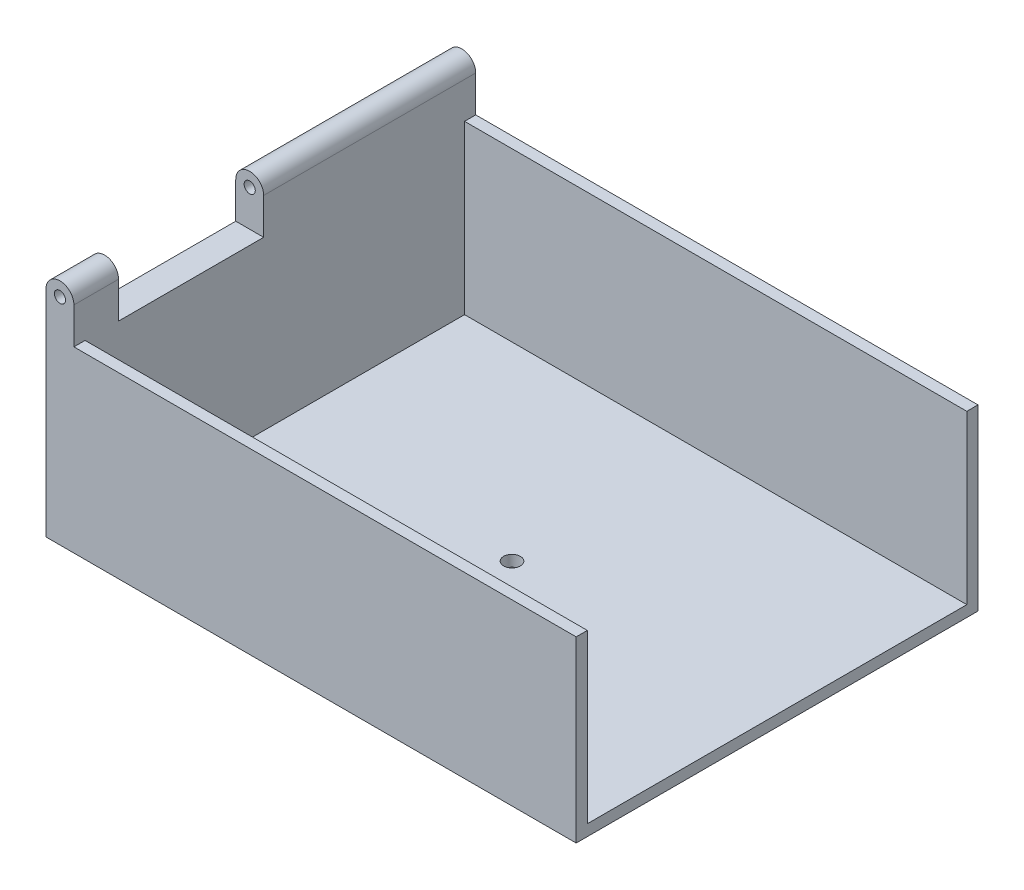
ISO-10303-21;
HEADER;
FILE_DESCRIPTION(('STEP AP214'),'2;1');
FILE_NAME('part.step','',(''),(''),'','','');
FILE_SCHEMA(('AUTOMOTIVE_DESIGN { 1 0 10303 214 1 1 1 1 }'));
ENDSEC;
DATA;
#1=APPLICATION_CONTEXT('core data for automotive mechanical design processes');
#2=APPLICATION_PROTOCOL_DEFINITION('international standard','automotive_design',2000,#1);
#3=PRODUCT_CONTEXT('',#1,'mechanical');
#4=PRODUCT('Part','Part','',(#3));
#5=PRODUCT_RELATED_PRODUCT_CATEGORY('part','',(#4));
#6=PRODUCT_DEFINITION_FORMATION('','',#4);
#7=PRODUCT_DEFINITION_CONTEXT('part definition',#1,'design');
#8=PRODUCT_DEFINITION('design','',#6,#7);
#9=PRODUCT_DEFINITION_SHAPE('','',#8);
#10=(LENGTH_UNIT() NAMED_UNIT(*) SI_UNIT(.MILLI.,.METRE.));
#11=(NAMED_UNIT(*) PLANE_ANGLE_UNIT() SI_UNIT($,.RADIAN.));
#12=(NAMED_UNIT(*) SI_UNIT($,.STERADIAN.) SOLID_ANGLE_UNIT());
#13=UNCERTAINTY_MEASURE_WITH_UNIT(LENGTH_MEASURE(1.E-05),#10,'distance_accuracy_value','');
#14=(GEOMETRIC_REPRESENTATION_CONTEXT(3) GLOBAL_UNCERTAINTY_ASSIGNED_CONTEXT((#13)) GLOBAL_UNIT_ASSIGNED_CONTEXT((#10,
#11,#12)) REPRESENTATION_CONTEXT('',''));
#15=CARTESIAN_POINT('',(0.,0.,0.));
#16=DIRECTION('',(0.,0.,1.));
#17=DIRECTION('',(1.,0.,0.));
#18=AXIS2_PLACEMENT_3D('',#15,#16,#17);
#19=CARTESIAN_POINT('',(-45.,38.5,-36.));
#20=DIRECTION('',(0.,0.,1.));
#21=DIRECTION('',(1.,0.,0.));
#22=AXIS2_PLACEMENT_3D('',#19,#20,#21);
#23=CYLINDRICAL_SURFACE('',#22,2.5);
#24=CARTESIAN_POINT('',(-45.,38.5,28.));
#25=DIRECTION('',(0.,0.,1.));
#26=DIRECTION('',(1.,0.,0.));
#27=AXIS2_PLACEMENT_3D('',#24,#25,#26);
#28=CIRCLE('',#27,2.5);
#29=CARTESIAN_POINT('',(-47.5,38.5,28.));
#30=VERTEX_POINT('',#29);
#31=CARTESIAN_POINT('',(-42.5,38.5,28.));
#32=VERTEX_POINT('',#31);
#33=EDGE_CURVE('E197',#30,#32,#28,.F.);
#34=ORIENTED_EDGE('',*,*,#33,.F.);
#35=DIRECTION('',(0.,0.,1.));
#36=VECTOR('',#35,1.);
#37=CARTESIAN_POINT('',(-47.5,38.5,-36.));
#38=LINE('',#37,#36);
#39=CARTESIAN_POINT('',(-47.5,38.5,36.));
#40=VERTEX_POINT('',#39);
#41=EDGE_CURVE('E216',#30,#40,#38,.T.);
#42=ORIENTED_EDGE('',*,*,#41,.T.);
#43=CARTESIAN_POINT('',(-45.,38.5,36.));
#44=DIRECTION('',(0.,0.,1.));
#45=DIRECTION('',(1.,0.,0.));
#46=AXIS2_PLACEMENT_3D('',#43,#44,#45);
#47=CIRCLE('',#46,2.5);
#48=CARTESIAN_POINT('',(-42.5,38.5,36.));
#49=VERTEX_POINT('',#48);
#50=EDGE_CURVE('E152',#49,#40,#47,.T.);
#51=ORIENTED_EDGE('',*,*,#50,.F.);
#52=DIRECTION('',(0.,0.,1.));
#53=VECTOR('',#52,1.);
#54=CARTESIAN_POINT('',(-42.5,38.5,-36.));
#55=LINE('',#54,#53);
#56=EDGE_CURVE('E147',#32,#49,#55,.T.);
#57=ORIENTED_EDGE('',*,*,#56,.F.);
#58=EDGE_LOOP('',(#34,#42,#51,#57));
#59=FACE_BOUND('',#58,.T.);
#60=ADVANCED_FACE('F39',(#59),#23,.T.);
#61=CARTESIAN_POINT('',(-45.,38.5,-36.));
#62=DIRECTION('',(0.,0.,1.));
#63=DIRECTION('',(1.,0.,0.));
#64=AXIS2_PLACEMENT_3D('',#61,#62,#63);
#65=CYLINDRICAL_SURFACE('',#64,0.999999999999998);
#66=CARTESIAN_POINT('',(-45.,38.5,28.));
#67=DIRECTION('',(0.,0.,1.));
#68=DIRECTION('',(1.,0.,0.));
#69=AXIS2_PLACEMENT_3D('',#66,#67,#68);
#70=CIRCLE('',#69,0.999999999999998);
#71=CARTESIAN_POINT('',(-44.,38.5,28.));
#72=VERTEX_POINT('',#71);
#73=EDGE_CURVE('E196',#72,#72,#70,.F.);
#74=ORIENTED_EDGE('',*,*,#73,.T.);
#75=EDGE_LOOP('',(#74));
#76=FACE_BOUND('',#75,.T.);
#77=CARTESIAN_POINT('',(-45.,38.5,36.));
#78=DIRECTION('',(0.,0.,1.));
#79=DIRECTION('',(1.,0.,0.));
#80=AXIS2_PLACEMENT_3D('',#77,#78,#79);
#81=CIRCLE('',#80,0.999999999999998);
#82=CARTESIAN_POINT('',(-44.,38.5,36.));
#83=VERTEX_POINT('',#82);
#84=EDGE_CURVE('E200',#83,#83,#81,.T.);
#85=ORIENTED_EDGE('',*,*,#84,.T.);
#86=EDGE_LOOP('',(#85));
#87=FACE_BOUND('',#86,.T.);
#88=ADVANCED_FACE('F261',(#76,#87),#65,.F.);
#89=CARTESIAN_POINT('',(47.5,35.,36.));
#90=DIRECTION('',(-1.,0.,0.));
#91=DIRECTION('',(0.,0.,1.));
#92=AXIS2_PLACEMENT_3D('',#89,#90,#91);
#93=PLANE('',#92);
#94=DIRECTION('',(0.,-1.,0.));
#95=VECTOR('',#94,1.);
#96=CARTESIAN_POINT('',(47.5,35.,-36.));
#97=LINE('',#96,#95);
#98=CARTESIAN_POINT('',(47.5,32.,-36.));
#99=VERTEX_POINT('',#98);
#100=CARTESIAN_POINT('',(47.5,0.,-36.));
#101=VERTEX_POINT('',#100);
#102=EDGE_CURVE('E47',#99,#101,#97,.T.);
#103=ORIENTED_EDGE('',*,*,#102,.F.);
#104=DIRECTION('',(0.,0.,-1.));
#105=VECTOR('',#104,1.);
#106=CARTESIAN_POINT('',(47.5,32.,36.));
#107=LINE('',#106,#105);
#108=CARTESIAN_POINT('',(47.5,32.,-34.));
#109=VERTEX_POINT('',#108);
#110=EDGE_CURVE('E164',#109,#99,#107,.T.);
#111=ORIENTED_EDGE('',*,*,#110,.F.);
#112=DIRECTION('',(0.,1.,0.));
#113=VECTOR('',#112,1.);
#114=CARTESIAN_POINT('',(47.5,2.,-34.));
#115=LINE('',#114,#113);
#116=CARTESIAN_POINT('',(47.5,2.,-34.));
#117=VERTEX_POINT('',#116);
#118=EDGE_CURVE('E234',#117,#109,#115,.T.);
#119=ORIENTED_EDGE('',*,*,#118,.F.);
#120=DIRECTION('',(0.,0.,-1.));
#121=VECTOR('',#120,1.);
#122=CARTESIAN_POINT('',(47.5,2.,34.));
#123=LINE('',#122,#121);
#124=CARTESIAN_POINT('',(47.5,2.,34.));
#125=VERTEX_POINT('',#124);
#126=EDGE_CURVE('E225',#125,#117,#123,.T.);
#127=ORIENTED_EDGE('',*,*,#126,.F.);
#128=DIRECTION('',(0.,1.,0.));
#129=VECTOR('',#128,1.);
#130=CARTESIAN_POINT('',(47.5,2.,34.));
#131=LINE('',#130,#129);
#132=CARTESIAN_POINT('',(47.5,32.,34.));
#133=VERTEX_POINT('',#132);
#134=EDGE_CURVE('E237',#125,#133,#131,.T.);
#135=ORIENTED_EDGE('',*,*,#134,.T.);
#136=CARTESIAN_POINT('',(47.5,32.,36.));
#137=VERTEX_POINT('',#136);
#138=EDGE_CURVE('E62',#137,#133,#107,.T.);
#139=ORIENTED_EDGE('',*,*,#138,.F.);
#140=DIRECTION('',(0.,-1.,0.));
#141=VECTOR('',#140,1.);
#142=CARTESIAN_POINT('',(47.5,35.,36.));
#143=LINE('',#142,#141);
#144=CARTESIAN_POINT('',(47.5,0.,36.));
#145=VERTEX_POINT('',#144);
#146=EDGE_CURVE('E163',#137,#145,#143,.T.);
#147=ORIENTED_EDGE('',*,*,#146,.T.);
#148=DIRECTION('',(0.,0.,-1.));
#149=VECTOR('',#148,1.);
#150=CARTESIAN_POINT('',(47.5,0.,36.));
#151=LINE('',#150,#149);
#152=EDGE_CURVE('E233',#145,#101,#151,.T.);
#153=ORIENTED_EDGE('',*,*,#152,.T.);
#154=EDGE_LOOP('',(#103,#111,#119,#127,#135,#139,#147,#153));
#155=FACE_BOUND('',#154,.T.);
#156=ADVANCED_FACE('F41',(#155),#93,.F.);
#157=CARTESIAN_POINT('',(-47.5,35.,-36.));
#158=DIRECTION('',(0.,0.,1.));
#159=DIRECTION('',(1.,0.,0.));
#160=AXIS2_PLACEMENT_3D('',#157,#158,#159);
#161=PLANE('',#160);
#162=DIRECTION('',(0.,1.,0.));
#163=VECTOR('',#162,1.);
#164=CARTESIAN_POINT('',(-42.5,35.,-36.));
#165=LINE('',#164,#163);
#166=CARTESIAN_POINT('',(-42.5,32.,-36.));
#167=VERTEX_POINT('',#166);
#168=CARTESIAN_POINT('',(-42.5,38.5,-36.));
#169=VERTEX_POINT('',#168);
#170=EDGE_CURVE('E205',#167,#169,#165,.T.);
#171=ORIENTED_EDGE('',*,*,#170,.F.);
#172=DIRECTION('',(-1.,0.,0.));
#173=VECTOR('',#172,1.);
#174=CARTESIAN_POINT('',(-42.5,32.,-36.));
#175=LINE('',#174,#173);
#176=EDGE_CURVE('E169',#99,#167,#175,.T.);
#177=ORIENTED_EDGE('',*,*,#176,.F.);
#178=ORIENTED_EDGE('',*,*,#102,.T.);
#179=DIRECTION('',(-1.,0.,0.));
#180=VECTOR('',#179,1.);
#181=CARTESIAN_POINT('',(-47.5,0.,-36.));
#182=LINE('',#181,#180);
#183=CARTESIAN_POINT('',(-47.5,0.,-36.));
#184=VERTEX_POINT('',#183);
#185=EDGE_CURVE('E243',#101,#184,#182,.T.);
#186=ORIENTED_EDGE('',*,*,#185,.T.);
#187=DIRECTION('',(0.,-1.,0.));
#188=VECTOR('',#187,1.);
#189=CARTESIAN_POINT('',(-47.5,35.,-36.));
#190=LINE('',#189,#188);
#191=CARTESIAN_POINT('',(-47.5,38.5,-36.));
#192=VERTEX_POINT('',#191);
#193=EDGE_CURVE('E253',#192,#184,#190,.T.);
#194=ORIENTED_EDGE('',*,*,#193,.F.);
#195=CARTESIAN_POINT('',(-45.,38.5,-36.));
#196=DIRECTION('',(0.,0.,1.));
#197=DIRECTION('',(1.,0.,0.));
#198=AXIS2_PLACEMENT_3D('',#195,#196,#197);
#199=CIRCLE('',#198,2.5);
#200=EDGE_CURVE('E208',#169,#192,#199,.T.);
#201=ORIENTED_EDGE('',*,*,#200,.F.);
#202=EDGE_LOOP('',(#171,#177,#178,#186,#194,#201));
#203=FACE_BOUND('',#202,.T.);
#204=CARTESIAN_POINT('',(-45.,38.5,-36.));
#205=DIRECTION('',(0.,0.,1.));
#206=DIRECTION('',(1.,0.,0.));
#207=AXIS2_PLACEMENT_3D('',#204,#205,#206);
#208=CIRCLE('',#207,0.999999999999998);
#209=CARTESIAN_POINT('',(-44.,38.5,-36.));
#210=VERTEX_POINT('',#209);
#211=EDGE_CURVE('E153',#210,#210,#208,.T.);
#212=ORIENTED_EDGE('',*,*,#211,.T.);
#213=EDGE_LOOP('',(#212));
#214=FACE_BOUND('',#213,.T.);
#215=ADVANCED_FACE('F305',(#203,#214),#161,.F.);
#216=CARTESIAN_POINT('',(-47.5,35.,36.));
#217=DIRECTION('',(1.,0.,0.));
#218=DIRECTION('',(0.,0.,-1.));
#219=AXIS2_PLACEMENT_3D('',#216,#217,#218);
#220=PLANE('',#219);
#221=ORIENTED_EDGE('',*,*,#41,.F.);
#222=DIRECTION('',(0.,1.,0.));
#223=VECTOR('',#222,1.);
#224=CARTESIAN_POINT('',(-47.5,32.,28.));
#225=LINE('',#224,#223);
#226=CARTESIAN_POINT('',(-47.5,32.,28.));
#227=VERTEX_POINT('',#226);
#228=EDGE_CURVE('E188',#227,#30,#225,.T.);
#229=ORIENTED_EDGE('',*,*,#228,.F.);
#230=DIRECTION('',(0.,0.,1.));
#231=VECTOR('',#230,1.);
#232=CARTESIAN_POINT('',(-47.5,32.,28.));
#233=LINE('',#232,#231);
#234=CARTESIAN_POINT('',(-47.5,32.,1.99999999999999));
#235=VERTEX_POINT('',#234);
#236=EDGE_CURVE('E179',#235,#227,#233,.T.);
#237=ORIENTED_EDGE('',*,*,#236,.F.);
#238=DIRECTION('',(0.,1.,0.));
#239=VECTOR('',#238,1.);
#240=CARTESIAN_POINT('',(-47.5,32.,1.99999999999999));
#241=LINE('',#240,#239);
#242=CARTESIAN_POINT('',(-47.5,38.5,1.99999999999999));
#243=VERTEX_POINT('',#242);
#244=EDGE_CURVE('E190',#235,#243,#241,.T.);
#245=ORIENTED_EDGE('',*,*,#244,.T.);
#246=EDGE_CURVE('E212',#192,#243,#38,.T.);
#247=ORIENTED_EDGE('',*,*,#246,.F.);
#248=ORIENTED_EDGE('',*,*,#193,.T.);
#249=DIRECTION('',(0.,0.,1.));
#250=VECTOR('',#249,1.);
#251=CARTESIAN_POINT('',(-47.5,0.,36.));
#252=LINE('',#251,#250);
#253=CARTESIAN_POINT('',(-47.5,0.,36.));
#254=VERTEX_POINT('',#253);
#255=EDGE_CURVE('E245',#184,#254,#252,.T.);
#256=ORIENTED_EDGE('',*,*,#255,.T.);
#257=DIRECTION('',(0.,-1.,0.));
#258=VECTOR('',#257,1.);
#259=CARTESIAN_POINT('',(-47.5,35.,36.));
#260=LINE('',#259,#258);
#261=EDGE_CURVE('E250',#40,#254,#260,.T.);
#262=ORIENTED_EDGE('',*,*,#261,.F.);
#263=EDGE_LOOP('',(#221,#229,#237,#245,#247,#248,#256,#262));
#264=FACE_BOUND('',#263,.T.);
#265=ADVANCED_FACE('F312',(#264),#220,.F.);
#266=CARTESIAN_POINT('',(-47.5,35.,36.));
#267=DIRECTION('',(0.,0.,-1.));
#268=DIRECTION('',(-1.,0.,0.));
#269=AXIS2_PLACEMENT_3D('',#266,#267,#268);
#270=PLANE('',#269);
#271=DIRECTION('',(1.,0.,0.));
#272=VECTOR('',#271,1.);
#273=CARTESIAN_POINT('',(-42.5,32.,36.));
#274=LINE('',#273,#272);
#275=CARTESIAN_POINT('',(-42.5,32.,36.));
#276=VERTEX_POINT('',#275);
#277=EDGE_CURVE('E156',#276,#137,#274,.T.);
#278=ORIENTED_EDGE('',*,*,#277,.F.);
#279=DIRECTION('',(0.,1.,0.));
#280=VECTOR('',#279,1.);
#281=CARTESIAN_POINT('',(-42.5,35.,36.));
#282=LINE('',#281,#280);
#283=EDGE_CURVE('E140',#276,#49,#282,.T.);
#284=ORIENTED_EDGE('',*,*,#283,.T.);
#285=ORIENTED_EDGE('',*,*,#50,.T.);
#286=ORIENTED_EDGE('',*,*,#261,.T.);
#287=DIRECTION('',(1.,0.,0.));
#288=VECTOR('',#287,1.);
#289=CARTESIAN_POINT('',(-47.5,0.,36.));
#290=LINE('',#289,#288);
#291=EDGE_CURVE('E247',#254,#145,#290,.T.);
#292=ORIENTED_EDGE('',*,*,#291,.T.);
#293=ORIENTED_EDGE('',*,*,#146,.F.);
#294=EDGE_LOOP('',(#278,#284,#285,#286,#292,#293));
#295=FACE_BOUND('',#294,.T.);
#296=ORIENTED_EDGE('',*,*,#84,.F.);
#297=EDGE_LOOP('',(#296));
#298=FACE_BOUND('',#297,.T.);
#299=ADVANCED_FACE('F160',(#295,#298),#270,.F.);
#300=CARTESIAN_POINT('',(0.,0.,0.));
#301=DIRECTION('',(0.,-1.,0.));
#302=DIRECTION('',(0.,0.,-1.));
#303=AXIS2_PLACEMENT_3D('',#300,#301,#302);
#304=PLANE('',#303);
#305=CARTESIAN_POINT('',(0.,0.,0.));
#306=DIRECTION('',(0.,1.,0.));
#307=DIRECTION('',(0.,0.,1.));
#308=AXIS2_PLACEMENT_3D('',#305,#306,#307);
#309=CIRCLE('',#308,1.5);
#310=CARTESIAN_POINT('',(0.,0.,1.5));
#311=VERTEX_POINT('',#310);
#312=EDGE_CURVE('E157',#311,#311,#309,.T.);
#313=ORIENTED_EDGE('',*,*,#312,.T.);
#314=EDGE_LOOP('',(#313));
#315=FACE_BOUND('',#314,.T.);
#316=ORIENTED_EDGE('',*,*,#152,.F.);
#317=ORIENTED_EDGE('',*,*,#291,.F.);
#318=ORIENTED_EDGE('',*,*,#255,.F.);
#319=ORIENTED_EDGE('',*,*,#185,.F.);
#320=EDGE_LOOP('',(#316,#317,#318,#319));
#321=FACE_BOUND('',#320,.T.);
#322=ADVANCED_FACE('F322',(#315,#321),#304,.T.);
#323=CARTESIAN_POINT('',(-42.5,2.,34.));
#324=DIRECTION('',(-1.,0.,0.));
#325=DIRECTION('',(0.,0.,1.));
#326=AXIS2_PLACEMENT_3D('',#323,#324,#325);
#327=PLANE('',#326);
#328=DIRECTION('',(0.,1.,0.));
#329=VECTOR('',#328,1.);
#330=CARTESIAN_POINT('',(-42.5,2.,-34.));
#331=LINE('',#330,#329);
#332=CARTESIAN_POINT('',(-42.5,2.,-34.));
#333=VERTEX_POINT('',#332);
#334=CARTESIAN_POINT('',(-42.5,32.,-34.));
#335=VERTEX_POINT('',#334);
#336=EDGE_CURVE('E231',#333,#335,#331,.T.);
#337=ORIENTED_EDGE('',*,*,#336,.T.);
#338=DIRECTION('',(0.,0.,1.));
#339=VECTOR('',#338,1.);
#340=CARTESIAN_POINT('',(-42.5,32.,36.));
#341=LINE('',#340,#339);
#342=EDGE_CURVE('E54',#167,#335,#341,.T.);
#343=ORIENTED_EDGE('',*,*,#342,.F.);
#344=ORIENTED_EDGE('',*,*,#170,.T.);
#345=CARTESIAN_POINT('',(-42.5,38.5,1.99999999999999));
#346=VERTEX_POINT('',#345);
#347=EDGE_CURVE('E217',#169,#346,#55,.T.);
#348=ORIENTED_EDGE('',*,*,#347,.T.);
#349=DIRECTION('',(0.,1.,0.));
#350=VECTOR('',#349,1.);
#351=CARTESIAN_POINT('',(-42.5,32.,2.));
#352=LINE('',#351,#350);
#353=CARTESIAN_POINT('',(-42.5,32.,2.));
#354=VERTEX_POINT('',#353);
#355=EDGE_CURVE('E184',#354,#346,#352,.T.);
#356=ORIENTED_EDGE('',*,*,#355,.F.);
#357=DIRECTION('',(0.,0.,-1.));
#358=VECTOR('',#357,1.);
#359=CARTESIAN_POINT('',(-42.5,32.,28.));
#360=LINE('',#359,#358);
#361=CARTESIAN_POINT('',(-42.5,32.,28.));
#362=VERTEX_POINT('',#361);
#363=EDGE_CURVE('E173',#362,#354,#360,.T.);
#364=ORIENTED_EDGE('',*,*,#363,.F.);
#365=DIRECTION('',(0.,1.,0.));
#366=VECTOR('',#365,1.);
#367=CARTESIAN_POINT('',(-42.5,32.,28.));
#368=LINE('',#367,#366);
#369=EDGE_CURVE('E185',#362,#32,#368,.T.);
#370=ORIENTED_EDGE('',*,*,#369,.T.);
#371=ORIENTED_EDGE('',*,*,#56,.T.);
#372=ORIENTED_EDGE('',*,*,#283,.F.);
#373=CARTESIAN_POINT('',(-42.5,32.,34.));
#374=VERTEX_POINT('',#373);
#375=EDGE_CURVE('E144',#374,#276,#341,.T.);
#376=ORIENTED_EDGE('',*,*,#375,.F.);
#377=DIRECTION('',(0.,1.,0.));
#378=VECTOR('',#377,1.);
#379=CARTESIAN_POINT('',(-42.5,2.,34.));
#380=LINE('',#379,#378);
#381=CARTESIAN_POINT('',(-42.5,2.,34.));
#382=VERTEX_POINT('',#381);
#383=EDGE_CURVE('E230',#382,#374,#380,.T.);
#384=ORIENTED_EDGE('',*,*,#383,.F.);
#385=DIRECTION('',(0.,0.,1.));
#386=VECTOR('',#385,1.);
#387=CARTESIAN_POINT('',(-42.5,2.,34.));
#388=LINE('',#387,#386);
#389=EDGE_CURVE('E215',#333,#382,#388,.T.);
#390=ORIENTED_EDGE('',*,*,#389,.F.);
#391=EDGE_LOOP('',(#337,#343,#344,#348,#356,#364,#370,#371,#372,#376,#384,#390));
#392=FACE_BOUND('',#391,.T.);
#393=ADVANCED_FACE('F143',(#392),#327,.F.);
#394=CARTESIAN_POINT('',(-42.5,2.,-34.));
#395=DIRECTION('',(0.,0.,-1.));
#396=DIRECTION('',(-1.,0.,0.));
#397=AXIS2_PLACEMENT_3D('',#394,#395,#396);
#398=PLANE('',#397);
#399=ORIENTED_EDGE('',*,*,#118,.T.);
#400=DIRECTION('',(-1.,0.,0.));
#401=VECTOR('',#400,1.);
#402=CARTESIAN_POINT('',(-42.5,32.,-34.));
#403=LINE('',#402,#401);
#404=EDGE_CURVE('E171',#109,#335,#403,.T.);
#405=ORIENTED_EDGE('',*,*,#404,.T.);
#406=ORIENTED_EDGE('',*,*,#336,.F.);
#407=DIRECTION('',(-1.,0.,0.));
#408=VECTOR('',#407,1.);
#409=CARTESIAN_POINT('',(-42.5,2.,-34.));
#410=LINE('',#409,#408);
#411=EDGE_CURVE('E227',#117,#333,#410,.T.);
#412=ORIENTED_EDGE('',*,*,#411,.F.);
#413=EDGE_LOOP('',(#399,#405,#406,#412));
#414=FACE_BOUND('',#413,.T.);
#415=ADVANCED_FACE('F333',(#414),#398,.F.);
#416=CARTESIAN_POINT('',(-42.5,2.,34.));
#417=DIRECTION('',(0.,0.,1.));
#418=DIRECTION('',(1.,0.,0.));
#419=AXIS2_PLACEMENT_3D('',#416,#417,#418);
#420=PLANE('',#419);
#421=ORIENTED_EDGE('',*,*,#383,.T.);
#422=DIRECTION('',(1.,0.,0.));
#423=VECTOR('',#422,1.);
#424=CARTESIAN_POINT('',(-42.5,32.,34.));
#425=LINE('',#424,#423);
#426=EDGE_CURVE('E11',#374,#133,#425,.T.);
#427=ORIENTED_EDGE('',*,*,#426,.T.);
#428=ORIENTED_EDGE('',*,*,#134,.F.);
#429=DIRECTION('',(1.,0.,0.));
#430=VECTOR('',#429,1.);
#431=CARTESIAN_POINT('',(-42.5,2.,34.));
#432=LINE('',#431,#430);
#433=EDGE_CURVE('E222',#382,#125,#432,.T.);
#434=ORIENTED_EDGE('',*,*,#433,.F.);
#435=EDGE_LOOP('',(#421,#427,#428,#434));
#436=FACE_BOUND('',#435,.T.);
#437=ADVANCED_FACE('F296',(#436),#420,.F.);
#438=CARTESIAN_POINT('',(0.,2.,0.));
#439=DIRECTION('',(0.,-1.,0.));
#440=DIRECTION('',(0.,0.,-1.));
#441=AXIS2_PLACEMENT_3D('',#438,#439,#440);
#442=PLANE('',#441);
#443=CARTESIAN_POINT('',(0.,2.,0.));
#444=DIRECTION('',(0.,1.,0.));
#445=DIRECTION('',(0.,0.,1.));
#446=AXIS2_PLACEMENT_3D('',#443,#444,#445);
#447=CIRCLE('',#446,1.5);
#448=CARTESIAN_POINT('',(0.,2.,1.5));
#449=VERTEX_POINT('',#448);
#450=EDGE_CURVE('E482',#449,#449,#447,.T.);
#451=ORIENTED_EDGE('',*,*,#450,.F.);
#452=EDGE_LOOP('',(#451));
#453=FACE_BOUND('',#452,.T.);
#454=ORIENTED_EDGE('',*,*,#389,.T.);
#455=ORIENTED_EDGE('',*,*,#433,.T.);
#456=ORIENTED_EDGE('',*,*,#126,.T.);
#457=ORIENTED_EDGE('',*,*,#411,.T.);
#458=EDGE_LOOP('',(#454,#455,#456,#457));
#459=FACE_BOUND('',#458,.T.);
#460=ADVANCED_FACE('F290',(#453,#459),#442,.F.);
#461=CARTESIAN_POINT('',(-45.,38.5,1.99999999999999));
#462=DIRECTION('',(0.,0.,-1.));
#463=DIRECTION('',(-1.,0.,0.));
#464=AXIS2_PLACEMENT_3D('',#461,#462,#463);
#465=CIRCLE('',#464,2.5);
#466=EDGE_CURVE('E194',#346,#243,#465,.F.);
#467=ORIENTED_EDGE('',*,*,#466,.F.);
#468=ORIENTED_EDGE('',*,*,#347,.F.);
#469=ORIENTED_EDGE('',*,*,#200,.T.);
#470=ORIENTED_EDGE('',*,*,#246,.T.);
#471=EDGE_LOOP('',(#467,#468,#469,#470));
#472=FACE_BOUND('',#471,.T.);
#473=ADVANCED_FACE('F277',(#472),#23,.T.);
#474=CARTESIAN_POINT('',(-45.,38.5,1.99999999999999));
#475=DIRECTION('',(0.,0.,-1.));
#476=DIRECTION('',(-1.,0.,0.));
#477=AXIS2_PLACEMENT_3D('',#474,#475,#476);
#478=CIRCLE('',#477,0.999999999999998);
#479=CARTESIAN_POINT('',(-46.,38.5,1.99999999999999));
#480=VERTEX_POINT('',#479);
#481=EDGE_CURVE('E187',#480,#480,#478,.F.);
#482=ORIENTED_EDGE('',*,*,#481,.T.);
#483=EDGE_LOOP('',(#482));
#484=FACE_BOUND('',#483,.T.);
#485=ORIENTED_EDGE('',*,*,#211,.F.);
#486=EDGE_LOOP('',(#485));
#487=FACE_BOUND('',#486,.T.);
#488=ADVANCED_FACE('F267',(#484,#487),#65,.F.);
#489=CARTESIAN_POINT('',(-42.5,32.,28.));
#490=DIRECTION('',(0.,0.,1.));
#491=DIRECTION('',(1.,0.,0.));
#492=AXIS2_PLACEMENT_3D('',#489,#490,#491);
#493=PLANE('',#492);
#494=ORIENTED_EDGE('',*,*,#33,.T.);
#495=ORIENTED_EDGE('',*,*,#369,.F.);
#496=DIRECTION('',(1.,0.,0.));
#497=VECTOR('',#496,1.);
#498=CARTESIAN_POINT('',(-42.5,32.,28.));
#499=LINE('',#498,#497);
#500=EDGE_CURVE('E181',#227,#362,#499,.T.);
#501=ORIENTED_EDGE('',*,*,#500,.F.);
#502=ORIENTED_EDGE('',*,*,#228,.T.);
#503=EDGE_LOOP('',(#494,#495,#501,#502));
#504=FACE_BOUND('',#503,.T.);
#505=ORIENTED_EDGE('',*,*,#73,.F.);
#506=EDGE_LOOP('',(#505));
#507=FACE_BOUND('',#506,.T.);
#508=ADVANCED_FACE('F264',(#504,#507),#493,.F.);
#509=CARTESIAN_POINT('',(-42.5,32.,2.));
#510=DIRECTION('',(0.,0.,-1.));
#511=DIRECTION('',(-1.,0.,0.));
#512=AXIS2_PLACEMENT_3D('',#509,#510,#511);
#513=PLANE('',#512);
#514=ORIENTED_EDGE('',*,*,#466,.T.);
#515=ORIENTED_EDGE('',*,*,#244,.F.);
#516=DIRECTION('',(-1.,0.,0.));
#517=VECTOR('',#516,1.);
#518=CARTESIAN_POINT('',(-42.5,32.,2.));
#519=LINE('',#518,#517);
#520=EDGE_CURVE('E176',#354,#235,#519,.T.);
#521=ORIENTED_EDGE('',*,*,#520,.F.);
#522=ORIENTED_EDGE('',*,*,#355,.T.);
#523=EDGE_LOOP('',(#514,#515,#521,#522));
#524=FACE_BOUND('',#523,.T.);
#525=ORIENTED_EDGE('',*,*,#481,.F.);
#526=EDGE_LOOP('',(#525));
#527=FACE_BOUND('',#526,.T.);
#528=ADVANCED_FACE('F266',(#524,#527),#513,.F.);
#529=CARTESIAN_POINT('',(0.,32.,0.));
#530=DIRECTION('',(0.,1.,0.));
#531=DIRECTION('',(0.,0.,1.));
#532=AXIS2_PLACEMENT_3D('',#529,#530,#531);
#533=PLANE('',#532);
#534=ORIENTED_EDGE('',*,*,#363,.T.);
#535=ORIENTED_EDGE('',*,*,#520,.T.);
#536=ORIENTED_EDGE('',*,*,#236,.T.);
#537=ORIENTED_EDGE('',*,*,#500,.T.);
#538=EDGE_LOOP('',(#534,#535,#536,#537));
#539=FACE_BOUND('',#538,.T.);
#540=ADVANCED_FACE('F274',(#539),#533,.T.);
#541=CARTESIAN_POINT('',(0.,32.,0.));
#542=DIRECTION('',(0.,-1.,0.));
#543=DIRECTION('',(0.,0.,-1.));
#544=AXIS2_PLACEMENT_3D('',#541,#542,#543);
#545=PLANE('',#544);
#546=ORIENTED_EDGE('',*,*,#375,.T.);
#547=ORIENTED_EDGE('',*,*,#277,.T.);
#548=ORIENTED_EDGE('',*,*,#138,.T.);
#549=ORIENTED_EDGE('',*,*,#426,.F.);
#550=EDGE_LOOP('',(#546,#547,#548,#549));
#551=FACE_BOUND('',#550,.T.);
#552=ADVANCED_FACE('F155',(#551),#545,.F.);
#553=ORIENTED_EDGE('',*,*,#110,.T.);
#554=ORIENTED_EDGE('',*,*,#176,.T.);
#555=ORIENTED_EDGE('',*,*,#342,.T.);
#556=ORIENTED_EDGE('',*,*,#404,.F.);
#557=EDGE_LOOP('',(#553,#554,#555,#556));
#558=FACE_BOUND('',#557,.T.);
#559=ADVANCED_FACE('F334',(#558),#545,.F.);
#560=CARTESIAN_POINT('',(0.,0.,0.));
#561=DIRECTION('',(0.,1.,0.));
#562=DIRECTION('',(0.,0.,1.));
#563=AXIS2_PLACEMENT_3D('',#560,#561,#562);
#564=CYLINDRICAL_SURFACE('',#563,1.5);
#565=ORIENTED_EDGE('',*,*,#312,.F.);
#566=EDGE_LOOP('',(#565));
#567=FACE_BOUND('',#566,.T.);
#568=ORIENTED_EDGE('',*,*,#450,.T.);
#569=EDGE_LOOP('',(#568));
#570=FACE_BOUND('',#569,.T.);
#571=ADVANCED_FACE('F336',(#567,#570),#564,.F.);
#572=CLOSED_SHELL('',(#60,#88,#156,#215,#265,#299,#322,#393,#415,#437,#460,#473,#488,#508,#528,
#540,#552,#559,#571));
#573=MANIFOLD_SOLID_BREP('B2',#572);
#574=ADVANCED_BREP_SHAPE_REPRESENTATION('',(#18,#573),#14);
#575=SHAPE_DEFINITION_REPRESENTATION(#9,#574);
ENDSEC;
END-ISO-10303-21;
